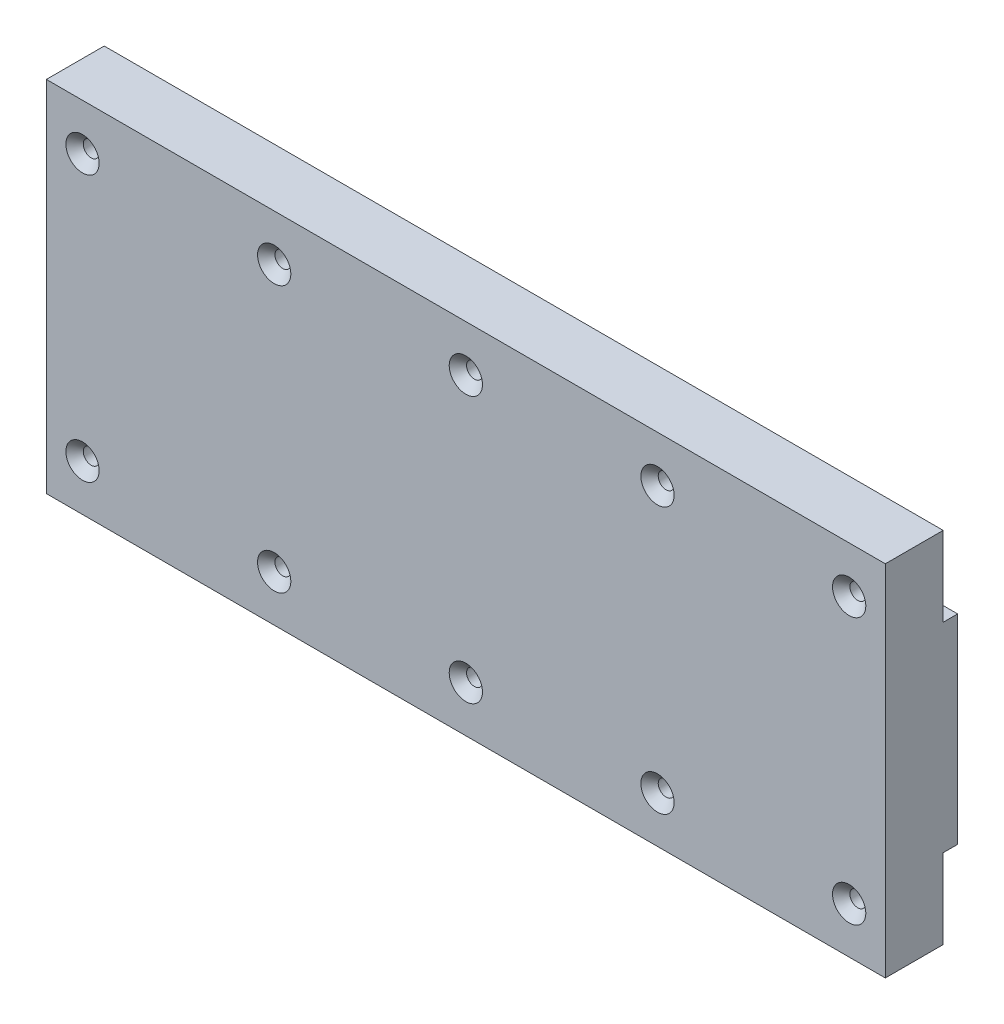
ISO-10303-21;
HEADER;
FILE_DESCRIPTION(('STEP AP214'),'2;1');
FILE_NAME('part.step','',(''),(''),'','','');
FILE_SCHEMA(('AUTOMOTIVE_DESIGN { 1 0 10303 214 1 1 1 1 }'));
ENDSEC;
DATA;
#1=APPLICATION_CONTEXT('core data for automotive mechanical design processes');
#2=APPLICATION_PROTOCOL_DEFINITION('international standard','automotive_design',2000,#1);
#3=PRODUCT_CONTEXT('',#1,'mechanical');
#4=PRODUCT('Part','Part','',(#3));
#5=PRODUCT_RELATED_PRODUCT_CATEGORY('part','',(#4));
#6=PRODUCT_DEFINITION_FORMATION('','',#4);
#7=PRODUCT_DEFINITION_CONTEXT('part definition',#1,'design');
#8=PRODUCT_DEFINITION('design','',#6,#7);
#9=PRODUCT_DEFINITION_SHAPE('','',#8);
#10=(LENGTH_UNIT() NAMED_UNIT(*) SI_UNIT(.MILLI.,.METRE.));
#11=(NAMED_UNIT(*) PLANE_ANGLE_UNIT() SI_UNIT($,.RADIAN.));
#12=(NAMED_UNIT(*) SI_UNIT($,.STERADIAN.) SOLID_ANGLE_UNIT());
#13=UNCERTAINTY_MEASURE_WITH_UNIT(LENGTH_MEASURE(1.E-05),#10,'distance_accuracy_value','');
#14=(GEOMETRIC_REPRESENTATION_CONTEXT(3) GLOBAL_UNCERTAINTY_ASSIGNED_CONTEXT((#13)) GLOBAL_UNIT_ASSIGNED_CONTEXT((#10,
#11,#12)) REPRESENTATION_CONTEXT('',''));
#15=CARTESIAN_POINT('',(0.,0.,0.));
#16=DIRECTION('',(0.,0.,1.));
#17=DIRECTION('',(1.,0.,0.));
#18=AXIS2_PLACEMENT_3D('',#15,#16,#17);
#19=CARTESIAN_POINT('',(580.,-69.,0.));
#20=DIRECTION('',(0.,0.,1.));
#21=DIRECTION('',(0.,-1.,0.));
#22=AXIS2_PLACEMENT_3D('',#19,#20,#21);
#23=PLANE('',#22);
#24=CARTESIAN_POINT('',(25.,-92.,0.));
#25=DIRECTION('',(0.,0.,1.));
#26=DIRECTION('',(0.,-1.,0.));
#27=AXIS2_PLACEMENT_3D('',#24,#25,#26);
#28=CIRCLE('',#27,5.5);
#29=CARTESIAN_POINT('',(25.,-97.5,0.));
#30=VERTEX_POINT('',#29);
#31=EDGE_CURVE('E150',#30,#30,#28,.T.);
#32=ORIENTED_EDGE('',*,*,#31,.T.);
#33=EDGE_LOOP('',(#32));
#34=FACE_BOUND('',#33,.T.);
#35=CARTESIAN_POINT('',(157.5,-92.,0.));
#36=DIRECTION('',(0.,0.,1.));
#37=DIRECTION('',(0.,-1.,0.));
#38=AXIS2_PLACEMENT_3D('',#35,#36,#37);
#39=CIRCLE('',#38,5.50000000000002);
#40=CARTESIAN_POINT('',(157.5,-97.5,0.));
#41=VERTEX_POINT('',#40);
#42=EDGE_CURVE('E390',#41,#41,#39,.T.);
#43=ORIENTED_EDGE('',*,*,#42,.T.);
#44=EDGE_LOOP('',(#43));
#45=FACE_BOUND('',#44,.T.);
#46=CARTESIAN_POINT('',(290.,-92.,0.));
#47=DIRECTION('',(0.,0.,1.));
#48=DIRECTION('',(0.,-1.,0.));
#49=AXIS2_PLACEMENT_3D('',#46,#47,#48);
#50=CIRCLE('',#49,5.50000000000002);
#51=CARTESIAN_POINT('',(290.,-97.5,0.));
#52=VERTEX_POINT('',#51);
#53=EDGE_CURVE('E386',#52,#52,#50,.T.);
#54=ORIENTED_EDGE('',*,*,#53,.T.);
#55=EDGE_LOOP('',(#54));
#56=FACE_BOUND('',#55,.T.);
#57=CARTESIAN_POINT('',(422.5,-92.,0.));
#58=DIRECTION('',(0.,0.,1.));
#59=DIRECTION('',(0.,-1.,0.));
#60=AXIS2_PLACEMENT_3D('',#57,#58,#59);
#61=CIRCLE('',#60,5.50000000000007);
#62=CARTESIAN_POINT('',(422.5,-97.5000000000001,0.));
#63=VERTEX_POINT('',#62);
#64=EDGE_CURVE('E382',#63,#63,#61,.T.);
#65=ORIENTED_EDGE('',*,*,#64,.T.);
#66=EDGE_LOOP('',(#65));
#67=FACE_BOUND('',#66,.T.);
#68=CARTESIAN_POINT('',(555.,-92.,0.));
#69=DIRECTION('',(0.,0.,1.));
#70=DIRECTION('',(0.,-1.,0.));
#71=AXIS2_PLACEMENT_3D('',#68,#69,#70);
#72=CIRCLE('',#71,5.49999999999996);
#73=CARTESIAN_POINT('',(555.,-97.5,0.));
#74=VERTEX_POINT('',#73);
#75=EDGE_CURVE('E372',#74,#74,#72,.T.);
#76=ORIENTED_EDGE('',*,*,#75,.T.);
#77=EDGE_LOOP('',(#76));
#78=FACE_BOUND('',#77,.T.);
#79=DIRECTION('',(0.,1.,0.));
#80=VECTOR('',#79,1.);
#81=CARTESIAN_POINT('',(0.,-69.,0.));
#82=LINE('',#81,#80);
#83=CARTESIAN_POINT('',(0.,-124.,0.));
#84=VERTEX_POINT('',#83);
#85=CARTESIAN_POINT('',(0.,-69.,0.));
#86=VERTEX_POINT('',#85);
#87=EDGE_CURVE('E145',#84,#86,#82,.T.);
#88=ORIENTED_EDGE('',*,*,#87,.T.);
#89=DIRECTION('',(-1.,0.,0.));
#90=VECTOR('',#89,1.);
#91=CARTESIAN_POINT('',(580.,-69.,0.));
#92=LINE('',#91,#90);
#93=CARTESIAN_POINT('',(580.,-69.,0.));
#94=VERTEX_POINT('',#93);
#95=EDGE_CURVE('E187',#94,#86,#92,.T.);
#96=ORIENTED_EDGE('',*,*,#95,.F.);
#97=DIRECTION('',(0.,1.,0.));
#98=VECTOR('',#97,1.);
#99=CARTESIAN_POINT('',(580.,-69.,0.));
#100=LINE('',#99,#98);
#101=CARTESIAN_POINT('',(580.,-124.,0.));
#102=VERTEX_POINT('',#101);
#103=EDGE_CURVE('E168',#102,#94,#100,.T.);
#104=ORIENTED_EDGE('',*,*,#103,.F.);
#105=DIRECTION('',(-1.,0.,0.));
#106=VECTOR('',#105,1.);
#107=CARTESIAN_POINT('',(580.,-124.,0.));
#108=LINE('',#107,#106);
#109=EDGE_CURVE('E141',#102,#84,#108,.T.);
#110=ORIENTED_EDGE('',*,*,#109,.T.);
#111=EDGE_LOOP('',(#88,#96,#104,#110));
#112=FACE_BOUND('',#111,.T.);
#113=ADVANCED_FACE('F41',(#34,#45,#56,#67,#78,#112),#23,.F.);
#114=CARTESIAN_POINT('',(580.,-69.,-10.));
#115=DIRECTION('',(0.,1.,0.));
#116=DIRECTION('',(0.,0.,1.));
#117=AXIS2_PLACEMENT_3D('',#114,#115,#116);
#118=PLANE('',#117);
#119=DIRECTION('',(0.,0.,-1.));
#120=VECTOR('',#119,1.);
#121=CARTESIAN_POINT('',(0.,-69.,-10.));
#122=LINE('',#121,#120);
#123=CARTESIAN_POINT('',(0.,-69.,-10.));
#124=VERTEX_POINT('',#123);
#125=EDGE_CURVE('E149',#86,#124,#122,.T.);
#126=ORIENTED_EDGE('',*,*,#125,.T.);
#127=DIRECTION('',(-1.,0.,0.));
#128=VECTOR('',#127,1.);
#129=CARTESIAN_POINT('',(580.,-69.,-10.));
#130=LINE('',#129,#128);
#131=CARTESIAN_POINT('',(580.,-69.,-10.));
#132=VERTEX_POINT('',#131);
#133=EDGE_CURVE('E183',#132,#124,#130,.T.);
#134=ORIENTED_EDGE('',*,*,#133,.F.);
#135=DIRECTION('',(0.,0.,-1.));
#136=VECTOR('',#135,1.);
#137=CARTESIAN_POINT('',(580.,-69.,-10.));
#138=LINE('',#137,#136);
#139=EDGE_CURVE('E104',#94,#132,#138,.T.);
#140=ORIENTED_EDGE('',*,*,#139,.F.);
#141=ORIENTED_EDGE('',*,*,#95,.T.);
#142=EDGE_LOOP('',(#126,#134,#140,#141));
#143=FACE_BOUND('',#142,.T.);
#144=ADVANCED_FACE('F283',(#143),#118,.F.);
#145=CARTESIAN_POINT('',(580.,69.,-9.99999999999999));
#146=DIRECTION('',(0.,0.,1.));
#147=DIRECTION('',(0.,-1.,0.));
#148=AXIS2_PLACEMENT_3D('',#145,#146,#147);
#149=PLANE('',#148);
#150=DIRECTION('',(0.,1.,0.));
#151=VECTOR('',#150,1.);
#152=CARTESIAN_POINT('',(0.,69.,-9.99999999999999));
#153=LINE('',#152,#151);
#154=CARTESIAN_POINT('',(0.,69.,-9.99999999999999));
#155=VERTEX_POINT('',#154);
#156=EDGE_CURVE('E153',#124,#155,#153,.T.);
#157=ORIENTED_EDGE('',*,*,#156,.T.);
#158=DIRECTION('',(-1.,0.,0.));
#159=VECTOR('',#158,1.);
#160=CARTESIAN_POINT('',(580.,69.,-9.99999999999999));
#161=LINE('',#160,#159);
#162=CARTESIAN_POINT('',(580.,69.,-9.99999999999999));
#163=VERTEX_POINT('',#162);
#164=EDGE_CURVE('E179',#163,#155,#161,.T.);
#165=ORIENTED_EDGE('',*,*,#164,.F.);
#166=DIRECTION('',(0.,1.,0.));
#167=VECTOR('',#166,1.);
#168=CARTESIAN_POINT('',(580.,69.,-9.99999999999999));
#169=LINE('',#168,#167);
#170=EDGE_CURVE('E400',#132,#163,#169,.T.);
#171=ORIENTED_EDGE('',*,*,#170,.F.);
#172=ORIENTED_EDGE('',*,*,#133,.T.);
#173=EDGE_LOOP('',(#157,#165,#171,#172));
#174=FACE_BOUND('',#173,.T.);
#175=ADVANCED_FACE('F289',(#174),#149,.F.);
#176=CARTESIAN_POINT('',(580.,69.,0.));
#177=DIRECTION('',(0.,-1.,0.));
#178=DIRECTION('',(0.,0.,-1.));
#179=AXIS2_PLACEMENT_3D('',#176,#177,#178);
#180=PLANE('',#179);
#181=DIRECTION('',(0.,0.,1.));
#182=VECTOR('',#181,1.);
#183=CARTESIAN_POINT('',(0.,69.,0.));
#184=LINE('',#183,#182);
#185=CARTESIAN_POINT('',(0.,69.,0.));
#186=VERTEX_POINT('',#185);
#187=EDGE_CURVE('E156',#155,#186,#184,.T.);
#188=ORIENTED_EDGE('',*,*,#187,.T.);
#189=DIRECTION('',(-1.,0.,0.));
#190=VECTOR('',#189,1.);
#191=CARTESIAN_POINT('',(580.,69.,0.));
#192=LINE('',#191,#190);
#193=CARTESIAN_POINT('',(580.,69.,0.));
#194=VERTEX_POINT('',#193);
#195=EDGE_CURVE('E175',#194,#186,#192,.T.);
#196=ORIENTED_EDGE('',*,*,#195,.F.);
#197=DIRECTION('',(0.,0.,1.));
#198=VECTOR('',#197,1.);
#199=CARTESIAN_POINT('',(580.,69.,0.));
#200=LINE('',#199,#198);
#201=EDGE_CURVE('E403',#163,#194,#200,.T.);
#202=ORIENTED_EDGE('',*,*,#201,.F.);
#203=ORIENTED_EDGE('',*,*,#164,.T.);
#204=EDGE_LOOP('',(#188,#196,#202,#203));
#205=FACE_BOUND('',#204,.T.);
#206=ADVANCED_FACE('F411',(#205),#180,.F.);
#207=CARTESIAN_POINT('',(580.,124.,0.));
#208=DIRECTION('',(0.,0.,1.));
#209=DIRECTION('',(0.,-1.,0.));
#210=AXIS2_PLACEMENT_3D('',#207,#208,#209);
#211=PLANE('',#210);
#212=CARTESIAN_POINT('',(157.5,92.,0.));
#213=DIRECTION('',(0.,0.,1.));
#214=DIRECTION('',(0.,-1.,0.));
#215=AXIS2_PLACEMENT_3D('',#212,#213,#214);
#216=CIRCLE('',#215,5.50000000000002);
#217=CARTESIAN_POINT('',(157.5,86.5,0.));
#218=VERTEX_POINT('',#217);
#219=EDGE_CURVE('E366',#218,#218,#216,.T.);
#220=ORIENTED_EDGE('',*,*,#219,.T.);
#221=EDGE_LOOP('',(#220));
#222=FACE_BOUND('',#221,.T.);
#223=CARTESIAN_POINT('',(422.5,92.,0.));
#224=DIRECTION('',(0.,0.,1.));
#225=DIRECTION('',(0.,-1.,0.));
#226=AXIS2_PLACEMENT_3D('',#223,#224,#225);
#227=CIRCLE('',#226,5.50000000000007);
#228=CARTESIAN_POINT('',(422.5,86.4999999999999,0.));
#229=VERTEX_POINT('',#228);
#230=EDGE_CURVE('E363',#229,#229,#227,.T.);
#231=ORIENTED_EDGE('',*,*,#230,.T.);
#232=EDGE_LOOP('',(#231));
#233=FACE_BOUND('',#232,.T.);
#234=CARTESIAN_POINT('',(555.,92.,0.));
#235=DIRECTION('',(0.,0.,1.));
#236=DIRECTION('',(0.,-1.,0.));
#237=AXIS2_PLACEMENT_3D('',#234,#235,#236);
#238=CIRCLE('',#237,5.49999999999996);
#239=CARTESIAN_POINT('',(555.,86.5,0.));
#240=VERTEX_POINT('',#239);
#241=EDGE_CURVE('E367',#240,#240,#238,.T.);
#242=ORIENTED_EDGE('',*,*,#241,.T.);
#243=EDGE_LOOP('',(#242));
#244=FACE_BOUND('',#243,.T.);
#245=CARTESIAN_POINT('',(290.,92.,0.));
#246=DIRECTION('',(0.,0.,1.));
#247=DIRECTION('',(0.,-1.,0.));
#248=AXIS2_PLACEMENT_3D('',#245,#246,#247);
#249=CIRCLE('',#248,5.50000000000002);
#250=CARTESIAN_POINT('',(290.,86.5,0.));
#251=VERTEX_POINT('',#250);
#252=EDGE_CURVE('E375',#251,#251,#249,.T.);
#253=ORIENTED_EDGE('',*,*,#252,.T.);
#254=EDGE_LOOP('',(#253));
#255=FACE_BOUND('',#254,.T.);
#256=CARTESIAN_POINT('',(25.,92.,0.));
#257=DIRECTION('',(0.,0.,1.));
#258=DIRECTION('',(0.,-1.,0.));
#259=AXIS2_PLACEMENT_3D('',#256,#257,#258);
#260=CIRCLE('',#259,5.5);
#261=CARTESIAN_POINT('',(25.,86.5,0.));
#262=VERTEX_POINT('',#261);
#263=EDGE_CURVE('E651',#262,#262,#260,.T.);
#264=ORIENTED_EDGE('',*,*,#263,.T.);
#265=EDGE_LOOP('',(#264));
#266=FACE_BOUND('',#265,.T.);
#267=DIRECTION('',(0.,1.,0.));
#268=VECTOR('',#267,1.);
#269=CARTESIAN_POINT('',(0.,124.,0.));
#270=LINE('',#269,#268);
#271=CARTESIAN_POINT('',(0.,124.,0.));
#272=VERTEX_POINT('',#271);
#273=EDGE_CURVE('E159',#186,#272,#270,.T.);
#274=ORIENTED_EDGE('',*,*,#273,.T.);
#275=DIRECTION('',(-1.,0.,0.));
#276=VECTOR('',#275,1.);
#277=CARTESIAN_POINT('',(580.,124.,0.));
#278=LINE('',#277,#276);
#279=CARTESIAN_POINT('',(580.,124.,0.));
#280=VERTEX_POINT('',#279);
#281=EDGE_CURVE('E134',#280,#272,#278,.T.);
#282=ORIENTED_EDGE('',*,*,#281,.F.);
#283=DIRECTION('',(0.,1.,0.));
#284=VECTOR('',#283,1.);
#285=CARTESIAN_POINT('',(580.,124.,0.));
#286=LINE('',#285,#284);
#287=EDGE_CURVE('E123',#194,#280,#286,.T.);
#288=ORIENTED_EDGE('',*,*,#287,.F.);
#289=ORIENTED_EDGE('',*,*,#195,.T.);
#290=EDGE_LOOP('',(#274,#282,#288,#289));
#291=FACE_BOUND('',#290,.T.);
#292=ADVANCED_FACE('F415',(#222,#233,#244,#255,#266,#291),#211,.F.);
#293=CARTESIAN_POINT('',(580.,124.,40.));
#294=DIRECTION('',(0.,-1.,0.));
#295=DIRECTION('',(0.,0.,-1.));
#296=AXIS2_PLACEMENT_3D('',#293,#294,#295);
#297=PLANE('',#296);
#298=DIRECTION('',(0.,0.,1.));
#299=VECTOR('',#298,1.);
#300=CARTESIAN_POINT('',(0.,124.,40.));
#301=LINE('',#300,#299);
#302=CARTESIAN_POINT('',(0.,124.,40.));
#303=VERTEX_POINT('',#302);
#304=EDGE_CURVE('E132',#272,#303,#301,.T.);
#305=ORIENTED_EDGE('',*,*,#304,.T.);
#306=DIRECTION('',(-1.,0.,0.));
#307=VECTOR('',#306,1.);
#308=CARTESIAN_POINT('',(580.,124.,40.));
#309=LINE('',#308,#307);
#310=CARTESIAN_POINT('',(580.,124.,40.));
#311=VERTEX_POINT('',#310);
#312=EDGE_CURVE('E129',#311,#303,#309,.T.);
#313=ORIENTED_EDGE('',*,*,#312,.F.);
#314=DIRECTION('',(0.,0.,1.));
#315=VECTOR('',#314,1.);
#316=CARTESIAN_POINT('',(580.,124.,40.));
#317=LINE('',#316,#315);
#318=EDGE_CURVE('E117',#280,#311,#317,.T.);
#319=ORIENTED_EDGE('',*,*,#318,.F.);
#320=ORIENTED_EDGE('',*,*,#281,.T.);
#321=EDGE_LOOP('',(#305,#313,#319,#320));
#322=FACE_BOUND('',#321,.T.);
#323=ADVANCED_FACE('F130',(#322),#297,.F.);
#324=CARTESIAN_POINT('',(580.,-124.,40.));
#325=DIRECTION('',(0.,0.,-1.));
#326=DIRECTION('',(-1.,0.,0.));
#327=AXIS2_PLACEMENT_3D('',#324,#325,#326);
#328=PLANE('',#327);
#329=CARTESIAN_POINT('',(555.,-92.,40.));
#330=DIRECTION('',(0.,0.,-1.));
#331=DIRECTION('',(-1.,0.,0.));
#332=AXIS2_PLACEMENT_3D('',#329,#330,#331);
#333=CIRCLE('',#332,11.5000000000001);
#334=CARTESIAN_POINT('',(543.5,-92.,40.));
#335=VERTEX_POINT('',#334);
#336=EDGE_CURVE('E230',#335,#335,#333,.T.);
#337=ORIENTED_EDGE('',*,*,#336,.T.);
#338=EDGE_LOOP('',(#337));
#339=FACE_BOUND('',#338,.T.);
#340=CARTESIAN_POINT('',(422.5,-92.,40.));
#341=DIRECTION('',(0.,0.,-1.));
#342=DIRECTION('',(-1.,0.,0.));
#343=AXIS2_PLACEMENT_3D('',#340,#341,#342);
#344=CIRCLE('',#343,11.5000000000002);
#345=CARTESIAN_POINT('',(411.,-92.,40.));
#346=VERTEX_POINT('',#345);
#347=EDGE_CURVE('E226',#346,#346,#344,.T.);
#348=ORIENTED_EDGE('',*,*,#347,.T.);
#349=EDGE_LOOP('',(#348));
#350=FACE_BOUND('',#349,.T.);
#351=CARTESIAN_POINT('',(290.,-92.,40.));
#352=DIRECTION('',(0.,0.,-1.));
#353=DIRECTION('',(-1.,0.,0.));
#354=AXIS2_PLACEMENT_3D('',#351,#352,#353);
#355=CIRCLE('',#354,11.5);
#356=CARTESIAN_POINT('',(278.5,-92.,40.));
#357=VERTEX_POINT('',#356);
#358=EDGE_CURVE('E222',#357,#357,#355,.T.);
#359=ORIENTED_EDGE('',*,*,#358,.T.);
#360=EDGE_LOOP('',(#359));
#361=FACE_BOUND('',#360,.T.);
#362=CARTESIAN_POINT('',(157.5,-92.,40.));
#363=DIRECTION('',(0.,0.,-1.));
#364=DIRECTION('',(-1.,0.,0.));
#365=AXIS2_PLACEMENT_3D('',#362,#363,#364);
#366=CIRCLE('',#365,11.5);
#367=CARTESIAN_POINT('',(146.,-92.,40.));
#368=VERTEX_POINT('',#367);
#369=EDGE_CURVE('E218',#368,#368,#366,.T.);
#370=ORIENTED_EDGE('',*,*,#369,.T.);
#371=EDGE_LOOP('',(#370));
#372=FACE_BOUND('',#371,.T.);
#373=CARTESIAN_POINT('',(25.,-92.,40.));
#374=DIRECTION('',(0.,0.,-1.));
#375=DIRECTION('',(-1.,0.,0.));
#376=AXIS2_PLACEMENT_3D('',#373,#374,#375);
#377=CIRCLE('',#376,11.5000000000001);
#378=CARTESIAN_POINT('',(13.4999999999999,-92.,40.));
#379=VERTEX_POINT('',#378);
#380=EDGE_CURVE('E214',#379,#379,#377,.T.);
#381=ORIENTED_EDGE('',*,*,#380,.T.);
#382=EDGE_LOOP('',(#381));
#383=FACE_BOUND('',#382,.T.);
#384=CARTESIAN_POINT('',(555.,92.,40.));
#385=DIRECTION('',(0.,0.,-1.));
#386=DIRECTION('',(-1.,0.,0.));
#387=AXIS2_PLACEMENT_3D('',#384,#385,#386);
#388=CIRCLE('',#387,11.5000000000001);
#389=CARTESIAN_POINT('',(543.5,92.,40.));
#390=VERTEX_POINT('',#389);
#391=EDGE_CURVE('E210',#390,#390,#388,.T.);
#392=ORIENTED_EDGE('',*,*,#391,.T.);
#393=EDGE_LOOP('',(#392));
#394=FACE_BOUND('',#393,.T.);
#395=CARTESIAN_POINT('',(422.5,92.,40.));
#396=DIRECTION('',(0.,0.,-1.));
#397=DIRECTION('',(-1.,0.,0.));
#398=AXIS2_PLACEMENT_3D('',#395,#396,#397);
#399=CIRCLE('',#398,11.5000000000002);
#400=CARTESIAN_POINT('',(411.,92.,40.));
#401=VERTEX_POINT('',#400);
#402=EDGE_CURVE('E206',#401,#401,#399,.T.);
#403=ORIENTED_EDGE('',*,*,#402,.T.);
#404=EDGE_LOOP('',(#403));
#405=FACE_BOUND('',#404,.T.);
#406=CARTESIAN_POINT('',(290.,92.,40.));
#407=DIRECTION('',(0.,0.,-1.));
#408=DIRECTION('',(-1.,0.,0.));
#409=AXIS2_PLACEMENT_3D('',#406,#407,#408);
#410=CIRCLE('',#409,11.5);
#411=CARTESIAN_POINT('',(278.5,92.,40.));
#412=VERTEX_POINT('',#411);
#413=EDGE_CURVE('E202',#412,#412,#410,.T.);
#414=ORIENTED_EDGE('',*,*,#413,.T.);
#415=EDGE_LOOP('',(#414));
#416=FACE_BOUND('',#415,.T.);
#417=CARTESIAN_POINT('',(157.5,92.,40.));
#418=DIRECTION('',(0.,0.,-1.));
#419=DIRECTION('',(-1.,0.,0.));
#420=AXIS2_PLACEMENT_3D('',#417,#418,#419);
#421=CIRCLE('',#420,11.5);
#422=CARTESIAN_POINT('',(146.,92.,40.));
#423=VERTEX_POINT('',#422);
#424=EDGE_CURVE('E198',#423,#423,#421,.T.);
#425=ORIENTED_EDGE('',*,*,#424,.T.);
#426=EDGE_LOOP('',(#425));
#427=FACE_BOUND('',#426,.T.);
#428=CARTESIAN_POINT('',(25.,92.,40.));
#429=DIRECTION('',(0.,0.,-1.));
#430=DIRECTION('',(-1.,0.,0.));
#431=AXIS2_PLACEMENT_3D('',#428,#429,#430);
#432=CIRCLE('',#431,11.5000000000001);
#433=CARTESIAN_POINT('',(13.4999999999999,92.,40.));
#434=VERTEX_POINT('',#433);
#435=EDGE_CURVE('E194',#434,#434,#432,.T.);
#436=ORIENTED_EDGE('',*,*,#435,.T.);
#437=EDGE_LOOP('',(#436));
#438=FACE_BOUND('',#437,.T.);
#439=DIRECTION('',(0.,-1.,0.));
#440=VECTOR('',#439,1.);
#441=CARTESIAN_POINT('',(0.,-124.,40.));
#442=LINE('',#441,#440);
#443=CARTESIAN_POINT('',(0.,-124.,40.));
#444=VERTEX_POINT('',#443);
#445=EDGE_CURVE('E89',#303,#444,#442,.T.);
#446=ORIENTED_EDGE('',*,*,#445,.T.);
#447=DIRECTION('',(-1.,0.,0.));
#448=VECTOR('',#447,1.);
#449=CARTESIAN_POINT('',(580.,-124.,40.));
#450=LINE('',#449,#448);
#451=CARTESIAN_POINT('',(580.,-124.,40.));
#452=VERTEX_POINT('',#451);
#453=EDGE_CURVE('E135',#452,#444,#450,.T.);
#454=ORIENTED_EDGE('',*,*,#453,.F.);
#455=DIRECTION('',(0.,-1.,0.));
#456=VECTOR('',#455,1.);
#457=CARTESIAN_POINT('',(580.,-124.,40.));
#458=LINE('',#457,#456);
#459=EDGE_CURVE('E121',#311,#452,#458,.T.);
#460=ORIENTED_EDGE('',*,*,#459,.F.);
#461=ORIENTED_EDGE('',*,*,#312,.T.);
#462=EDGE_LOOP('',(#446,#454,#460,#461));
#463=FACE_BOUND('',#462,.T.);
#464=ADVANCED_FACE('F137',(#339,#350,#361,#372,#383,#394,#405,#416,#427,#438,#463),#328,.F.);
#465=CARTESIAN_POINT('',(580.,-124.,0.));
#466=DIRECTION('',(0.,1.,0.));
#467=DIRECTION('',(0.,0.,1.));
#468=AXIS2_PLACEMENT_3D('',#465,#466,#467);
#469=PLANE('',#468);
#470=DIRECTION('',(0.,0.,-1.));
#471=VECTOR('',#470,1.);
#472=CARTESIAN_POINT('',(0.,-124.,0.));
#473=LINE('',#472,#471);
#474=EDGE_CURVE('E95',#444,#84,#473,.T.);
#475=ORIENTED_EDGE('',*,*,#474,.T.);
#476=ORIENTED_EDGE('',*,*,#109,.F.);
#477=DIRECTION('',(0.,0.,-1.));
#478=VECTOR('',#477,1.);
#479=CARTESIAN_POINT('',(580.,-124.,0.));
#480=LINE('',#479,#478);
#481=EDGE_CURVE('E60',#452,#102,#480,.T.);
#482=ORIENTED_EDGE('',*,*,#481,.F.);
#483=ORIENTED_EDGE('',*,*,#453,.T.);
#484=EDGE_LOOP('',(#475,#476,#482,#483));
#485=FACE_BOUND('',#484,.T.);
#486=ADVANCED_FACE('F423',(#485),#469,.F.);
#487=CARTESIAN_POINT('',(580.,0.,0.));
#488=DIRECTION('',(-1.,0.,0.));
#489=DIRECTION('',(0.,0.,1.));
#490=AXIS2_PLACEMENT_3D('',#487,#488,#489);
#491=PLANE('',#490);
#492=ORIENTED_EDGE('',*,*,#103,.T.);
#493=ORIENTED_EDGE('',*,*,#139,.T.);
#494=ORIENTED_EDGE('',*,*,#170,.T.);
#495=ORIENTED_EDGE('',*,*,#201,.T.);
#496=ORIENTED_EDGE('',*,*,#287,.T.);
#497=ORIENTED_EDGE('',*,*,#318,.T.);
#498=ORIENTED_EDGE('',*,*,#459,.T.);
#499=ORIENTED_EDGE('',*,*,#481,.T.);
#500=EDGE_LOOP('',(#492,#493,#494,#495,#496,#497,#498,#499));
#501=FACE_BOUND('',#500,.T.);
#502=ADVANCED_FACE('F119',(#501),#491,.F.);
#503=CARTESIAN_POINT('',(0.,0.,0.));
#504=DIRECTION('',(-1.,0.,0.));
#505=DIRECTION('',(0.,0.,1.));
#506=AXIS2_PLACEMENT_3D('',#503,#504,#505);
#507=PLANE('',#506);
#508=ORIENTED_EDGE('',*,*,#87,.F.);
#509=ORIENTED_EDGE('',*,*,#474,.F.);
#510=ORIENTED_EDGE('',*,*,#445,.F.);
#511=ORIENTED_EDGE('',*,*,#304,.F.);
#512=ORIENTED_EDGE('',*,*,#273,.F.);
#513=ORIENTED_EDGE('',*,*,#187,.F.);
#514=ORIENTED_EDGE('',*,*,#156,.F.);
#515=ORIENTED_EDGE('',*,*,#125,.F.);
#516=EDGE_LOOP('',(#508,#509,#510,#511,#512,#513,#514,#515));
#517=FACE_BOUND('',#516,.T.);
#518=ADVANCED_FACE('F418',(#517),#507,.T.);
#519=CARTESIAN_POINT('',(25.,92.,-10.));
#520=DIRECTION('',(0.,0.,1.));
#521=DIRECTION('',(1.,0.,0.));
#522=AXIS2_PLACEMENT_3D('',#519,#520,#521);
#523=CYLINDRICAL_SURFACE('',#522,5.5);
#524=CARTESIAN_POINT('',(25.,92.,33.9999999999999));
#525=DIRECTION('',(0.,0.,-1.));
#526=DIRECTION('',(-1.,0.,0.));
#527=AXIS2_PLACEMENT_3D('',#524,#525,#526);
#528=CIRCLE('',#527,5.5);
#529=CARTESIAN_POINT('',(19.5,92.,33.9999999999999));
#530=VERTEX_POINT('',#529);
#531=EDGE_CURVE('E11',#530,#530,#528,.F.);
#532=ORIENTED_EDGE('',*,*,#531,.T.);
#533=EDGE_LOOP('',(#532));
#534=FACE_BOUND('',#533,.T.);
#535=ORIENTED_EDGE('',*,*,#263,.F.);
#536=EDGE_LOOP('',(#535));
#537=FACE_BOUND('',#536,.T.);
#538=ADVANCED_FACE('F469',(#534,#537),#523,.F.);
#539=CARTESIAN_POINT('',(290.,92.,-10.));
#540=DIRECTION('',(0.,0.,1.));
#541=DIRECTION('',(1.,0.,0.));
#542=AXIS2_PLACEMENT_3D('',#539,#540,#541);
#543=CYLINDRICAL_SURFACE('',#542,5.50000000000002);
#544=CARTESIAN_POINT('',(290.,92.,34.));
#545=DIRECTION('',(0.,0.,-1.));
#546=DIRECTION('',(-1.,0.,0.));
#547=AXIS2_PLACEMENT_3D('',#544,#545,#546);
#548=CIRCLE('',#547,5.50000000000002);
#549=CARTESIAN_POINT('',(284.5,92.,34.));
#550=VERTEX_POINT('',#549);
#551=EDGE_CURVE('E258',#550,#550,#548,.F.);
#552=ORIENTED_EDGE('',*,*,#551,.T.);
#553=EDGE_LOOP('',(#552));
#554=FACE_BOUND('',#553,.T.);
#555=ORIENTED_EDGE('',*,*,#252,.F.);
#556=EDGE_LOOP('',(#555));
#557=FACE_BOUND('',#556,.T.);
#558=ADVANCED_FACE('F474',(#554,#557),#543,.F.);
#559=CARTESIAN_POINT('',(555.,92.,-10.));
#560=DIRECTION('',(0.,0.,1.));
#561=DIRECTION('',(1.,0.,0.));
#562=AXIS2_PLACEMENT_3D('',#559,#560,#561);
#563=CYLINDRICAL_SURFACE('',#562,5.49999999999996);
#564=CARTESIAN_POINT('',(555.,92.,33.9999999999999));
#565=DIRECTION('',(0.,0.,-1.));
#566=DIRECTION('',(-1.,0.,0.));
#567=AXIS2_PLACEMENT_3D('',#564,#565,#566);
#568=CIRCLE('',#567,5.49999999999996);
#569=CARTESIAN_POINT('',(549.5,92.,33.9999999999999));
#570=VERTEX_POINT('',#569);
#571=EDGE_CURVE('E250',#570,#570,#568,.F.);
#572=ORIENTED_EDGE('',*,*,#571,.T.);
#573=EDGE_LOOP('',(#572));
#574=FACE_BOUND('',#573,.T.);
#575=ORIENTED_EDGE('',*,*,#241,.F.);
#576=EDGE_LOOP('',(#575));
#577=FACE_BOUND('',#576,.T.);
#578=ADVANCED_FACE('F359',(#574,#577),#563,.F.);
#579=CARTESIAN_POINT('',(422.5,92.,-10.));
#580=DIRECTION('',(0.,0.,1.));
#581=DIRECTION('',(1.,0.,0.));
#582=AXIS2_PLACEMENT_3D('',#579,#580,#581);
#583=CYLINDRICAL_SURFACE('',#582,5.50000000000007);
#584=CARTESIAN_POINT('',(422.5,92.,33.9999999999999));
#585=DIRECTION('',(0.,0.,-1.));
#586=DIRECTION('',(-1.,0.,0.));
#587=AXIS2_PLACEMENT_3D('',#584,#585,#586);
#588=CIRCLE('',#587,5.50000000000007);
#589=CARTESIAN_POINT('',(417.,92.,33.9999999999999));
#590=VERTEX_POINT('',#589);
#591=EDGE_CURVE('E254',#590,#590,#588,.F.);
#592=ORIENTED_EDGE('',*,*,#591,.T.);
#593=EDGE_LOOP('',(#592));
#594=FACE_BOUND('',#593,.T.);
#595=ORIENTED_EDGE('',*,*,#230,.F.);
#596=EDGE_LOOP('',(#595));
#597=FACE_BOUND('',#596,.T.);
#598=ADVANCED_FACE('F356',(#594,#597),#583,.F.);
#599=CARTESIAN_POINT('',(157.5,92.,-10.));
#600=DIRECTION('',(0.,0.,1.));
#601=DIRECTION('',(1.,0.,0.));
#602=AXIS2_PLACEMENT_3D('',#599,#600,#601);
#603=CYLINDRICAL_SURFACE('',#602,5.50000000000002);
#604=CARTESIAN_POINT('',(157.5,92.,34.));
#605=DIRECTION('',(0.,0.,-1.));
#606=DIRECTION('',(-1.,0.,0.));
#607=AXIS2_PLACEMENT_3D('',#604,#605,#606);
#608=CIRCLE('',#607,5.50000000000002);
#609=CARTESIAN_POINT('',(152.,92.,34.));
#610=VERTEX_POINT('',#609);
#611=EDGE_CURVE('E52',#610,#610,#608,.F.);
#612=ORIENTED_EDGE('',*,*,#611,.T.);
#613=EDGE_LOOP('',(#612));
#614=FACE_BOUND('',#613,.T.);
#615=ORIENTED_EDGE('',*,*,#219,.F.);
#616=EDGE_LOOP('',(#615));
#617=FACE_BOUND('',#616,.T.);
#618=ADVANCED_FACE('F265',(#614,#617),#603,.F.);
#619=CARTESIAN_POINT('',(555.,-92.,-10.));
#620=DIRECTION('',(0.,0.,1.));
#621=DIRECTION('',(1.,0.,0.));
#622=AXIS2_PLACEMENT_3D('',#619,#620,#621);
#623=CYLINDRICAL_SURFACE('',#622,5.49999999999996);
#624=CARTESIAN_POINT('',(555.,-92.,33.9999999999999));
#625=DIRECTION('',(0.,0.,-1.));
#626=DIRECTION('',(-1.,0.,0.));
#627=AXIS2_PLACEMENT_3D('',#624,#625,#626);
#628=CIRCLE('',#627,5.49999999999996);
#629=CARTESIAN_POINT('',(549.5,-92.,33.9999999999999));
#630=VERTEX_POINT('',#629);
#631=EDGE_CURVE('E190',#630,#630,#628,.F.);
#632=ORIENTED_EDGE('',*,*,#631,.T.);
#633=EDGE_LOOP('',(#632));
#634=FACE_BOUND('',#633,.T.);
#635=ORIENTED_EDGE('',*,*,#75,.F.);
#636=EDGE_LOOP('',(#635));
#637=FACE_BOUND('',#636,.T.);
#638=ADVANCED_FACE('F510',(#634,#637),#623,.F.);
#639=CARTESIAN_POINT('',(422.5,-92.,-10.));
#640=DIRECTION('',(0.,0.,1.));
#641=DIRECTION('',(1.,0.,0.));
#642=AXIS2_PLACEMENT_3D('',#639,#640,#641);
#643=CYLINDRICAL_SURFACE('',#642,5.50000000000007);
#644=CARTESIAN_POINT('',(422.5,-92.,33.9999999999999));
#645=DIRECTION('',(0.,0.,-1.));
#646=DIRECTION('',(-1.,0.,0.));
#647=AXIS2_PLACEMENT_3D('',#644,#645,#646);
#648=CIRCLE('',#647,5.50000000000007);
#649=CARTESIAN_POINT('',(417.,-92.,33.9999999999999));
#650=VERTEX_POINT('',#649);
#651=EDGE_CURVE('E234',#650,#650,#648,.F.);
#652=ORIENTED_EDGE('',*,*,#651,.T.);
#653=EDGE_LOOP('',(#652));
#654=FACE_BOUND('',#653,.T.);
#655=ORIENTED_EDGE('',*,*,#64,.F.);
#656=EDGE_LOOP('',(#655));
#657=FACE_BOUND('',#656,.T.);
#658=ADVANCED_FACE('F519',(#654,#657),#643,.F.);
#659=CARTESIAN_POINT('',(290.,-92.,-10.));
#660=DIRECTION('',(0.,0.,1.));
#661=DIRECTION('',(1.,0.,0.));
#662=AXIS2_PLACEMENT_3D('',#659,#660,#661);
#663=CYLINDRICAL_SURFACE('',#662,5.50000000000002);
#664=CARTESIAN_POINT('',(290.,-92.,34.));
#665=DIRECTION('',(0.,0.,-1.));
#666=DIRECTION('',(-1.,0.,0.));
#667=AXIS2_PLACEMENT_3D('',#664,#665,#666);
#668=CIRCLE('',#667,5.50000000000002);
#669=CARTESIAN_POINT('',(284.5,-92.,34.));
#670=VERTEX_POINT('',#669);
#671=EDGE_CURVE('E238',#670,#670,#668,.F.);
#672=ORIENTED_EDGE('',*,*,#671,.T.);
#673=EDGE_LOOP('',(#672));
#674=FACE_BOUND('',#673,.T.);
#675=ORIENTED_EDGE('',*,*,#53,.F.);
#676=EDGE_LOOP('',(#675));
#677=FACE_BOUND('',#676,.T.);
#678=ADVANCED_FACE('F529',(#674,#677),#663,.F.);
#679=CARTESIAN_POINT('',(157.5,-92.,-10.));
#680=DIRECTION('',(0.,0.,1.));
#681=DIRECTION('',(1.,0.,0.));
#682=AXIS2_PLACEMENT_3D('',#679,#680,#681);
#683=CYLINDRICAL_SURFACE('',#682,5.50000000000002);
#684=CARTESIAN_POINT('',(157.5,-92.,34.));
#685=DIRECTION('',(0.,0.,-1.));
#686=DIRECTION('',(-1.,0.,0.));
#687=AXIS2_PLACEMENT_3D('',#684,#685,#686);
#688=CIRCLE('',#687,5.50000000000002);
#689=CARTESIAN_POINT('',(152.,-92.,34.));
#690=VERTEX_POINT('',#689);
#691=EDGE_CURVE('E242',#690,#690,#688,.F.);
#692=ORIENTED_EDGE('',*,*,#691,.T.);
#693=EDGE_LOOP('',(#692));
#694=FACE_BOUND('',#693,.T.);
#695=ORIENTED_EDGE('',*,*,#42,.F.);
#696=EDGE_LOOP('',(#695));
#697=FACE_BOUND('',#696,.T.);
#698=ADVANCED_FACE('F539',(#694,#697),#683,.F.);
#699=CARTESIAN_POINT('',(25.,-92.,-10.));
#700=DIRECTION('',(0.,0.,1.));
#701=DIRECTION('',(1.,0.,0.));
#702=AXIS2_PLACEMENT_3D('',#699,#700,#701);
#703=CYLINDRICAL_SURFACE('',#702,5.5);
#704=CARTESIAN_POINT('',(25.,-92.,33.9999999999999));
#705=DIRECTION('',(0.,0.,-1.));
#706=DIRECTION('',(-1.,0.,0.));
#707=AXIS2_PLACEMENT_3D('',#704,#705,#706);
#708=CIRCLE('',#707,5.5);
#709=CARTESIAN_POINT('',(19.5,-92.,33.9999999999999));
#710=VERTEX_POINT('',#709);
#711=EDGE_CURVE('E246',#710,#710,#708,.F.);
#712=ORIENTED_EDGE('',*,*,#711,.T.);
#713=EDGE_LOOP('',(#712));
#714=FACE_BOUND('',#713,.T.);
#715=ORIENTED_EDGE('',*,*,#31,.F.);
#716=EDGE_LOOP('',(#715));
#717=FACE_BOUND('',#716,.T.);
#718=ADVANCED_FACE('F303',(#714,#717),#703,.F.);
#719=CARTESIAN_POINT('',(555.,-92.,33.9999999999999));
#720=DIRECTION('',(0.,0.,1.));
#721=DIRECTION('',(1.,0.,0.));
#722=AXIS2_PLACEMENT_3D('',#719,#720,#721);
#723=CONICAL_SURFACE('',#722,5.49999999999996,0.785398163397451);
#724=ORIENTED_EDGE('',*,*,#336,.F.);
#725=EDGE_LOOP('',(#724));
#726=FACE_BOUND('',#725,.T.);
#727=ORIENTED_EDGE('',*,*,#631,.F.);
#728=EDGE_LOOP('',(#727));
#729=FACE_BOUND('',#728,.T.);
#730=ADVANCED_FACE('F296',(#726,#729),#723,.F.);
#731=CARTESIAN_POINT('',(422.5,-92.,33.9999999999999));
#732=DIRECTION('',(0.,0.,1.));
#733=DIRECTION('',(1.,0.,0.));
#734=AXIS2_PLACEMENT_3D('',#731,#732,#733);
#735=CONICAL_SURFACE('',#734,5.50000000000007,0.785398163397451);
#736=ORIENTED_EDGE('',*,*,#347,.F.);
#737=EDGE_LOOP('',(#736));
#738=FACE_BOUND('',#737,.T.);
#739=ORIENTED_EDGE('',*,*,#651,.F.);
#740=EDGE_LOOP('',(#739));
#741=FACE_BOUND('',#740,.T.);
#742=ADVANCED_FACE('F302',(#738,#741),#735,.F.);
#743=CARTESIAN_POINT('',(290.,-92.,34.));
#744=DIRECTION('',(0.,0.,1.));
#745=DIRECTION('',(1.,0.,0.));
#746=AXIS2_PLACEMENT_3D('',#743,#744,#745);
#747=CONICAL_SURFACE('',#746,5.50000000000002,0.785398163397451);
#748=ORIENTED_EDGE('',*,*,#358,.F.);
#749=EDGE_LOOP('',(#748));
#750=FACE_BOUND('',#749,.T.);
#751=ORIENTED_EDGE('',*,*,#671,.F.);
#752=EDGE_LOOP('',(#751));
#753=FACE_BOUND('',#752,.T.);
#754=ADVANCED_FACE('F310',(#750,#753),#747,.F.);
#755=CARTESIAN_POINT('',(157.5,-92.,34.));
#756=DIRECTION('',(0.,0.,1.));
#757=DIRECTION('',(1.,0.,0.));
#758=AXIS2_PLACEMENT_3D('',#755,#756,#757);
#759=CONICAL_SURFACE('',#758,5.50000000000002,0.785398163397454);
#760=ORIENTED_EDGE('',*,*,#369,.F.);
#761=EDGE_LOOP('',(#760));
#762=FACE_BOUND('',#761,.T.);
#763=ORIENTED_EDGE('',*,*,#691,.F.);
#764=EDGE_LOOP('',(#763));
#765=FACE_BOUND('',#764,.T.);
#766=ADVANCED_FACE('F317',(#762,#765),#759,.F.);
#767=CARTESIAN_POINT('',(25.,-92.,33.9999999999999));
#768=DIRECTION('',(0.,0.,1.));
#769=DIRECTION('',(1.,0.,0.));
#770=AXIS2_PLACEMENT_3D('',#767,#768,#769);
#771=CONICAL_SURFACE('',#770,5.5,0.785398163397451);
#772=ORIENTED_EDGE('',*,*,#380,.F.);
#773=EDGE_LOOP('',(#772));
#774=FACE_BOUND('',#773,.T.);
#775=ORIENTED_EDGE('',*,*,#711,.F.);
#776=EDGE_LOOP('',(#775));
#777=FACE_BOUND('',#776,.T.);
#778=ADVANCED_FACE('F324',(#774,#777),#771,.F.);
#779=CARTESIAN_POINT('',(555.,92.,33.9999999999999));
#780=DIRECTION('',(0.,0.,1.));
#781=DIRECTION('',(1.,0.,0.));
#782=AXIS2_PLACEMENT_3D('',#779,#780,#781);
#783=CONICAL_SURFACE('',#782,5.49999999999996,0.785398163397451);
#784=ORIENTED_EDGE('',*,*,#391,.F.);
#785=EDGE_LOOP('',(#784));
#786=FACE_BOUND('',#785,.T.);
#787=ORIENTED_EDGE('',*,*,#571,.F.);
#788=EDGE_LOOP('',(#787));
#789=FACE_BOUND('',#788,.T.);
#790=ADVANCED_FACE('F331',(#786,#789),#783,.F.);
#791=CARTESIAN_POINT('',(422.5,92.,33.9999999999999));
#792=DIRECTION('',(0.,0.,1.));
#793=DIRECTION('',(1.,0.,0.));
#794=AXIS2_PLACEMENT_3D('',#791,#792,#793);
#795=CONICAL_SURFACE('',#794,5.50000000000007,0.785398163397451);
#796=ORIENTED_EDGE('',*,*,#402,.F.);
#797=EDGE_LOOP('',(#796));
#798=FACE_BOUND('',#797,.T.);
#799=ORIENTED_EDGE('',*,*,#591,.F.);
#800=EDGE_LOOP('',(#799));
#801=FACE_BOUND('',#800,.T.);
#802=ADVANCED_FACE('F277',(#798,#801),#795,.F.);
#803=CARTESIAN_POINT('',(290.,92.,34.));
#804=DIRECTION('',(0.,0.,1.));
#805=DIRECTION('',(1.,0.,0.));
#806=AXIS2_PLACEMENT_3D('',#803,#804,#805);
#807=CONICAL_SURFACE('',#806,5.50000000000002,0.785398163397451);
#808=ORIENTED_EDGE('',*,*,#413,.F.);
#809=EDGE_LOOP('',(#808));
#810=FACE_BOUND('',#809,.T.);
#811=ORIENTED_EDGE('',*,*,#551,.F.);
#812=EDGE_LOOP('',(#811));
#813=FACE_BOUND('',#812,.T.);
#814=ADVANCED_FACE('F270',(#810,#813),#807,.F.);
#815=CARTESIAN_POINT('',(157.5,92.,34.));
#816=DIRECTION('',(0.,0.,1.));
#817=DIRECTION('',(1.,0.,0.));
#818=AXIS2_PLACEMENT_3D('',#815,#816,#817);
#819=CONICAL_SURFACE('',#818,5.50000000000002,0.785398163397454);
#820=ORIENTED_EDGE('',*,*,#424,.F.);
#821=EDGE_LOOP('',(#820));
#822=FACE_BOUND('',#821,.T.);
#823=ORIENTED_EDGE('',*,*,#611,.F.);
#824=EDGE_LOOP('',(#823));
#825=FACE_BOUND('',#824,.T.);
#826=ADVANCED_FACE('F268',(#822,#825),#819,.F.);
#827=CARTESIAN_POINT('',(25.,92.,33.9999999999999));
#828=DIRECTION('',(0.,0.,1.));
#829=DIRECTION('',(1.,0.,0.));
#830=AXIS2_PLACEMENT_3D('',#827,#828,#829);
#831=CONICAL_SURFACE('',#830,5.5,0.785398163397451);
#832=ORIENTED_EDGE('',*,*,#435,.F.);
#833=EDGE_LOOP('',(#832));
#834=FACE_BOUND('',#833,.T.);
#835=ORIENTED_EDGE('',*,*,#531,.F.);
#836=EDGE_LOOP('',(#835));
#837=FACE_BOUND('',#836,.T.);
#838=ADVANCED_FACE('F44',(#834,#837),#831,.F.);
#839=CLOSED_SHELL('',(#113,#144,#175,#206,#292,#323,#464,#486,#502,#518,#538,#558,#578,#598,
#618,#638,#658,#678,#698,#718,#730,#742,#754,#766,#778,#790,#802,#814,#826,#838));
#840=MANIFOLD_SOLID_BREP('B2',#839);
#841=ADVANCED_BREP_SHAPE_REPRESENTATION('',(#18,#840),#14);
#842=SHAPE_DEFINITION_REPRESENTATION(#9,#841);
ENDSEC;
END-ISO-10303-21;
